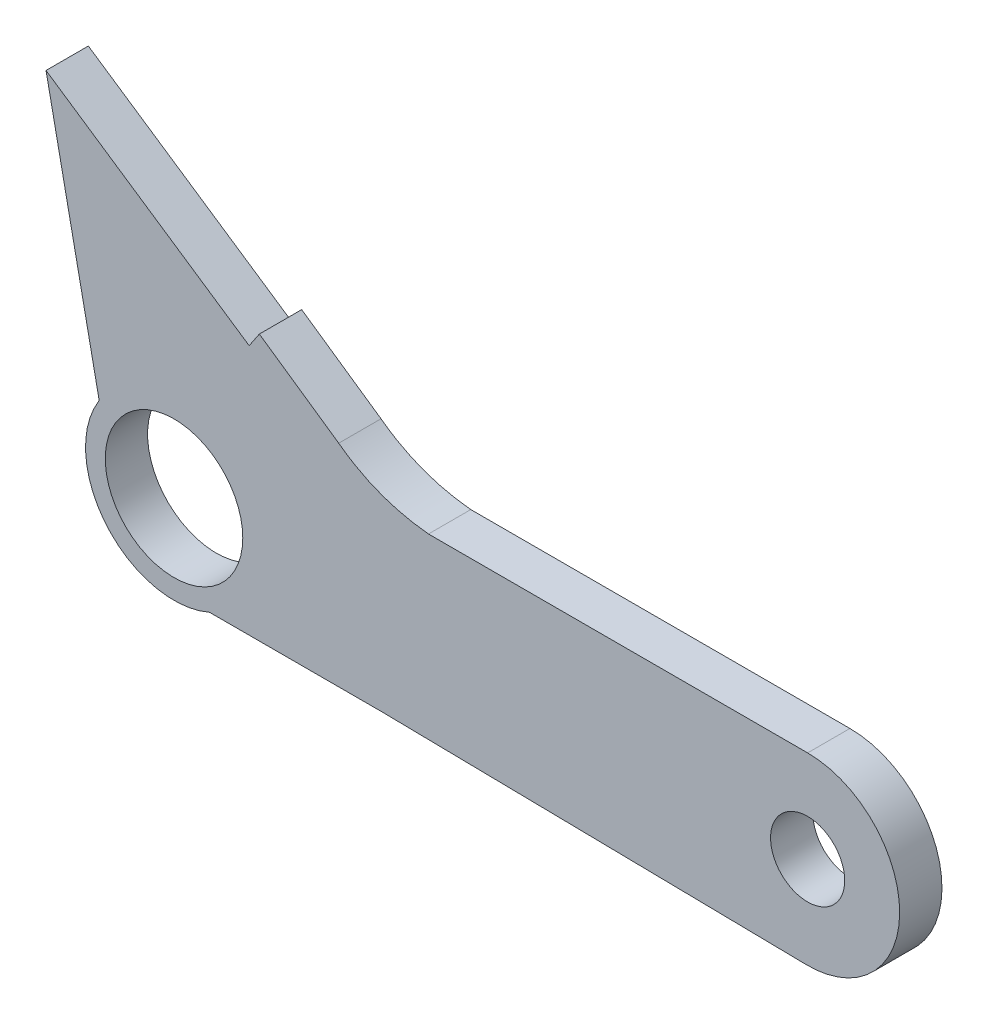
ISO-10303-21;
HEADER;
FILE_DESCRIPTION(('STEP AP214'),'2;1');
FILE_NAME('part.step','',(''),(''),'','','');
FILE_SCHEMA(('AUTOMOTIVE_DESIGN { 1 0 10303 214 1 1 1 1 }'));
ENDSEC;
DATA;
#1=APPLICATION_CONTEXT('core data for automotive mechanical design processes');
#2=APPLICATION_PROTOCOL_DEFINITION('international standard','automotive_design',2000,#1);
#3=PRODUCT_CONTEXT('',#1,'mechanical');
#4=PRODUCT('Part','Part','',(#3));
#5=PRODUCT_RELATED_PRODUCT_CATEGORY('part','',(#4));
#6=PRODUCT_DEFINITION_FORMATION('','',#4);
#7=PRODUCT_DEFINITION_CONTEXT('part definition',#1,'design');
#8=PRODUCT_DEFINITION('design','',#6,#7);
#9=PRODUCT_DEFINITION_SHAPE('','',#8);
#10=(LENGTH_UNIT() NAMED_UNIT(*) SI_UNIT(.MILLI.,.METRE.));
#11=(NAMED_UNIT(*) PLANE_ANGLE_UNIT() SI_UNIT($,.RADIAN.));
#12=(NAMED_UNIT(*) SI_UNIT($,.STERADIAN.) SOLID_ANGLE_UNIT());
#13=UNCERTAINTY_MEASURE_WITH_UNIT(LENGTH_MEASURE(1.E-05),#10,'distance_accuracy_value','');
#14=(GEOMETRIC_REPRESENTATION_CONTEXT(3) GLOBAL_UNCERTAINTY_ASSIGNED_CONTEXT((#13)) GLOBAL_UNIT_ASSIGNED_CONTEXT((#10,
#11,#12)) REPRESENTATION_CONTEXT('',''));
#15=CARTESIAN_POINT('',(0.,0.,0.));
#16=DIRECTION('',(0.,0.,1.));
#17=DIRECTION('',(1.,0.,0.));
#18=AXIS2_PLACEMENT_3D('',#15,#16,#17);
#19=CARTESIAN_POINT('',(-153.32908699017,31.6570272076157,3.80000000342412));
#20=DIRECTION('',(0.,0.,1.));
#21=DIRECTION('',(1.,0.,0.));
#22=AXIS2_PLACEMENT_3D('',#19,#20,#21);
#23=PLANE('',#22);
#24=CARTESIAN_POINT('',(-153.32908699017,31.6570272076157,3.80000000342412));
#25=DIRECTION('',(0.,0.,1.));
#26=DIRECTION('',(1.,0.,0.));
#27=AXIS2_PLACEMENT_3D('',#24,#25,#26);
#28=CIRCLE('',#27,4.90656360395826);
#29=CARTESIAN_POINT('',(-148.422523386211,31.6570272076157,3.80000000342412));
#30=VERTEX_POINT('',#29);
#31=EDGE_CURVE('E160',#30,#30,#28,.T.);
#32=ORIENTED_EDGE('',*,*,#31,.F.);
#33=EDGE_LOOP('',(#32));
#34=FACE_BOUND('',#33,.T.);
#35=CARTESIAN_POINT('',(-153.32908699017,31.6570272076157,3.80000000342412));
#36=DIRECTION('',(0.,0.,1.));
#37=DIRECTION('',(1.,0.,0.));
#38=AXIS2_PLACEMENT_3D('',#35,#36,#37);
#39=CIRCLE('',#38,12.1826586906075);
#40=CARTESIAN_POINT('',(-153.718100866553,19.4805810521968,3.80000000342412));
#41=VERTEX_POINT('',#40);
#42=CARTESIAN_POINT('',(-153.32908699017,43.8396858982233,3.80000000342412));
#43=VERTEX_POINT('',#42);
#44=EDGE_CURVE('E189',#41,#43,#39,.T.);
#45=ORIENTED_EDGE('',*,*,#44,.T.);
#46=DIRECTION('',(-1.,0.,0.));
#47=VECTOR('',#46,1.);
#48=CARTESIAN_POINT('',(-203.511333483619,43.8396858982233,3.80000000342412));
#49=LINE('',#48,#47);
#50=CARTESIAN_POINT('',(-203.511333483619,43.8396858982233,3.80000000342412));
#51=VERTEX_POINT('',#50);
#52=EDGE_CURVE('E108',#43,#51,#49,.T.);
#53=ORIENTED_EDGE('',*,*,#52,.T.);
#54=CARTESIAN_POINT('',(-203.511333483619,43.8396858982233,3.80000000342412));
#55=CARTESIAN_POINT('',(-208.172582178688,44.2976729303848,3.80000000342412));
#56=CARTESIAN_POINT('',(-212.097536786331,45.8384901922571,3.80000000342412));
#57=CARTESIAN_POINT('',(-215.391942553687,48.3061625787208,3.80000000342412));
#58=B_SPLINE_CURVE_WITH_KNOTS('',3,(#54,#55,#56,#57),.UNSPECIFIED.,.F.,.F.,(4,4),(0.24,0.28),.UNSPECIFIED.);
#59=CARTESIAN_POINT('',(-215.391942553687,48.3061625787208,3.80000000342412));
#60=VERTEX_POINT('',#59);
#61=EDGE_CURVE('E218',#51,#60,#58,.T.);
#62=ORIENTED_EDGE('',*,*,#61,.T.);
#63=DIRECTION('',(-0.822645279419272,0.568554961502569,0.));
#64=VECTOR('',#63,1.);
#65=CARTESIAN_POINT('',(-225.895010686111,55.5651497109446,3.80000000342412));
#66=LINE('',#65,#64);
#67=CARTESIAN_POINT('',(-225.895010686111,55.5651497109446,3.80000000342412));
#68=VERTEX_POINT('',#67);
#69=EDGE_CURVE('E238',#60,#68,#66,.T.);
#70=ORIENTED_EDGE('',*,*,#69,.T.);
#71=DIRECTION('',(-0.558654024014095,-0.829400796631435,0.));
#72=VECTOR('',#71,1.);
#73=CARTESIAN_POINT('',(-227.24597461826,53.5594529587881,3.80000000342412));
#74=LINE('',#73,#72);
#75=CARTESIAN_POINT('',(-227.24597461826,53.5594529587881,3.80000000342412));
#76=VERTEX_POINT('',#75);
#77=EDGE_CURVE('E234',#68,#76,#74,.T.);
#78=ORIENTED_EDGE('',*,*,#77,.T.);
#79=DIRECTION('',(-0.82942340172924,0.558620462088435,0.));
#80=VECTOR('',#79,1.);
#81=CARTESIAN_POINT('',(-254.12908699017,71.6653523393242,3.80000000342412));
#82=LINE('',#81,#80);
#83=CARTESIAN_POINT('',(-254.12908699017,71.6653523393242,3.80000000342412));
#84=VERTEX_POINT('',#83);
#85=EDGE_CURVE('E237',#76,#84,#82,.T.);
#86=ORIENTED_EDGE('',*,*,#85,.T.);
#87=DIRECTION('',(0.200817703010496,-0.979628628694358,0.));
#88=VECTOR('',#87,1.);
#89=CARTESIAN_POINT('',(-247.094072806183,37.3471563108404,3.80000000342412));
#90=LINE('',#89,#88);
#91=CARTESIAN_POINT('',(-247.094072806183,37.3471563108404,3.80000000342412));
#92=VERTEX_POINT('',#91);
#93=EDGE_CURVE('E133',#84,#92,#90,.T.);
#94=ORIENTED_EDGE('',*,*,#93,.T.);
#95=CARTESIAN_POINT('',(-237.18946647183,31.0987756420895,3.80000000342412));
#96=DIRECTION('',(0.,0.,1.));
#97=DIRECTION('',(1.,0.,0.));
#98=AXIS2_PLACEMENT_3D('',#95,#96,#97);
#99=CIRCLE('',#98,11.7108277939743);
#100=CARTESIAN_POINT('',(-232.489396699723,20.3725073367822,3.80000000342412));
#101=VERTEX_POINT('',#100);
#102=EDGE_CURVE('E127',#92,#101,#99,.T.);
#103=ORIENTED_EDGE('',*,*,#102,.T.);
#104=DIRECTION('',(1.,0.,0.));
#105=VECTOR('',#104,1.);
#106=CARTESIAN_POINT('',(-209.56836020208,20.3725073367822,3.80000000342412));
#107=LINE('',#106,#105);
#108=CARTESIAN_POINT('',(-209.56836020208,20.3725073367822,3.80000000342412));
#109=VERTEX_POINT('',#108);
#110=EDGE_CURVE('E131',#101,#109,#107,.T.);
#111=ORIENTED_EDGE('',*,*,#110,.T.);
#112=DIRECTION('',(0.999872504610725,-0.0159679217018297,0.));
#113=VECTOR('',#112,1.);
#114=CARTESIAN_POINT('',(-209.56836020208,20.3725073367822,3.80000000342412));
#115=LINE('',#114,#113);
#116=EDGE_CURVE('E59',#109,#41,#115,.T.);
#117=ORIENTED_EDGE('',*,*,#116,.T.);
#118=EDGE_LOOP('',(#45,#53,#62,#70,#78,#86,#94,#103,#111,#117));
#119=FACE_BOUND('',#118,.T.);
#120=CARTESIAN_POINT('',(-237.18946647183,31.0987756420895,3.80000000342412));
#121=DIRECTION('',(0.,0.,1.));
#122=DIRECTION('',(1.,0.,0.));
#123=AXIS2_PLACEMENT_3D('',#120,#121,#122);
#124=CIRCLE('',#123,9.10000000000002);
#125=CARTESIAN_POINT('',(-228.08946647183,31.0987756420895,3.80000000342412));
#126=VERTEX_POINT('',#125);
#127=EDGE_CURVE('E381',#126,#126,#124,.T.);
#128=ORIENTED_EDGE('',*,*,#127,.F.);
#129=EDGE_LOOP('',(#128));
#130=FACE_BOUND('',#129,.T.);
#131=ADVANCED_FACE('F41',(#34,#119,#130),#23,.T.);
#132=CARTESIAN_POINT('',(-153.32908699017,31.6570272076157,-1.79999999657588));
#133=DIRECTION('',(0.,0.,1.));
#134=DIRECTION('',(1.,0.,0.));
#135=AXIS2_PLACEMENT_3D('',#132,#133,#134);
#136=PLANE('',#135);
#137=CARTESIAN_POINT('',(-153.32908699017,31.6570272076157,-1.79999999657588));
#138=DIRECTION('',(0.,0.,1.));
#139=DIRECTION('',(1.,0.,0.));
#140=AXIS2_PLACEMENT_3D('',#137,#138,#139);
#141=CIRCLE('',#140,12.1826586906075);
#142=CARTESIAN_POINT('',(-153.718100866553,19.4805810521968,-1.79999999657588));
#143=VERTEX_POINT('',#142);
#144=CARTESIAN_POINT('',(-153.32908699017,43.8396858982233,-1.79999999657588));
#145=VERTEX_POINT('',#144);
#146=EDGE_CURVE('E155',#143,#145,#141,.T.);
#147=ORIENTED_EDGE('',*,*,#146,.F.);
#148=DIRECTION('',(0.999872504610725,-0.0159679217018297,0.));
#149=VECTOR('',#148,1.);
#150=CARTESIAN_POINT('',(-209.56836020208,20.3725073367822,-1.79999999657588));
#151=LINE('',#150,#149);
#152=CARTESIAN_POINT('',(-209.56836020208,20.3725073367822,-1.79999999657588));
#153=VERTEX_POINT('',#152);
#154=EDGE_CURVE('E100',#153,#143,#151,.T.);
#155=ORIENTED_EDGE('',*,*,#154,.F.);
#156=DIRECTION('',(1.,0.,0.));
#157=VECTOR('',#156,1.);
#158=CARTESIAN_POINT('',(-209.56836020208,20.3725073367822,-1.79999999657588));
#159=LINE('',#158,#157);
#160=CARTESIAN_POINT('',(-232.489396699723,20.3725073367822,-1.79999999657588));
#161=VERTEX_POINT('',#160);
#162=EDGE_CURVE('E94',#161,#153,#159,.T.);
#163=ORIENTED_EDGE('',*,*,#162,.F.);
#164=CARTESIAN_POINT('',(-237.18946647183,31.0987756420895,-1.79999999657588));
#165=DIRECTION('',(0.,0.,1.));
#166=DIRECTION('',(1.,0.,0.));
#167=AXIS2_PLACEMENT_3D('',#164,#165,#166);
#168=CIRCLE('',#167,11.7108277939743);
#169=CARTESIAN_POINT('',(-247.094072806183,37.3471563108404,-1.79999999657588));
#170=VERTEX_POINT('',#169);
#171=EDGE_CURVE('E142',#170,#161,#168,.T.);
#172=ORIENTED_EDGE('',*,*,#171,.F.);
#173=DIRECTION('',(0.200817703010496,-0.979628628694358,0.));
#174=VECTOR('',#173,1.);
#175=CARTESIAN_POINT('',(-247.094072806183,37.3471563108404,-1.79999999657588));
#176=LINE('',#175,#174);
#177=CARTESIAN_POINT('',(-254.12908699017,71.6653523393242,-1.79999999657588));
#178=VERTEX_POINT('',#177);
#179=EDGE_CURVE('E180',#178,#170,#176,.T.);
#180=ORIENTED_EDGE('',*,*,#179,.F.);
#181=DIRECTION('',(-0.82942340172924,0.558620462088435,0.));
#182=VECTOR('',#181,1.);
#183=CARTESIAN_POINT('',(-254.12908699017,71.6653523393242,-1.79999999657588));
#184=LINE('',#183,#182);
#185=CARTESIAN_POINT('',(-227.24597461826,53.5594529587881,-1.79999999657588));
#186=VERTEX_POINT('',#185);
#187=EDGE_CURVE('E177',#186,#178,#184,.T.);
#188=ORIENTED_EDGE('',*,*,#187,.F.);
#189=DIRECTION('',(-0.558654024014095,-0.829400796631435,0.));
#190=VECTOR('',#189,1.);
#191=CARTESIAN_POINT('',(-227.24597461826,53.5594529587881,-1.79999999657588));
#192=LINE('',#191,#190);
#193=CARTESIAN_POINT('',(-225.895010686111,55.5651497109446,-1.79999999657588));
#194=VERTEX_POINT('',#193);
#195=EDGE_CURVE('E174',#194,#186,#192,.T.);
#196=ORIENTED_EDGE('',*,*,#195,.F.);
#197=DIRECTION('',(-0.822645279419272,0.568554961502569,0.));
#198=VECTOR('',#197,1.);
#199=CARTESIAN_POINT('',(-225.895010686111,55.5651497109446,-1.79999999657588));
#200=LINE('',#199,#198);
#201=CARTESIAN_POINT('',(-215.391942553687,48.3061625787208,-1.79999999657588));
#202=VERTEX_POINT('',#201);
#203=EDGE_CURVE('E168',#202,#194,#200,.T.);
#204=ORIENTED_EDGE('',*,*,#203,.F.);
#205=CARTESIAN_POINT('',(-203.511333483619,43.8396858982233,-1.79999999657588));
#206=CARTESIAN_POINT('',(-208.172582178688,44.2976729303848,-1.79999999657588));
#207=CARTESIAN_POINT('',(-212.097536786331,45.8384901922571,-1.79999999657588));
#208=CARTESIAN_POINT('',(-215.391942553687,48.3061625787208,-1.79999999657588));
#209=B_SPLINE_CURVE_WITH_KNOTS('',3,(#205,#206,#207,#208),.UNSPECIFIED.,.F.,.F.,(4,4),(0.24,
0.28),.UNSPECIFIED.);
#210=CARTESIAN_POINT('',(-203.511333483619,43.8396858982233,-1.79999999657588));
#211=VERTEX_POINT('',#210);
#212=EDGE_CURVE('E163',#211,#202,#209,.T.);
#213=ORIENTED_EDGE('',*,*,#212,.F.);
#214=DIRECTION('',(-1.,0.,0.));
#215=VECTOR('',#214,1.);
#216=CARTESIAN_POINT('',(-203.511333483619,43.8396858982233,-1.79999999657588));
#217=LINE('',#216,#215);
#218=EDGE_CURVE('E159',#145,#211,#217,.T.);
#219=ORIENTED_EDGE('',*,*,#218,.F.);
#220=EDGE_LOOP('',(#147,#155,#163,#172,#180,#188,#196,#204,#213,#219));
#221=FACE_BOUND('',#220,.T.);
#222=CARTESIAN_POINT('',(-153.32908699017,31.6570272076157,-1.79999999657588));
#223=DIRECTION('',(0.,0.,1.));
#224=DIRECTION('',(1.,0.,0.));
#225=AXIS2_PLACEMENT_3D('',#222,#223,#224);
#226=CIRCLE('',#225,4.90656360395826);
#227=CARTESIAN_POINT('',(-148.422523386211,31.6570272076157,-1.79999999657588));
#228=VERTEX_POINT('',#227);
#229=EDGE_CURVE('E389',#228,#228,#226,.T.);
#230=ORIENTED_EDGE('',*,*,#229,.T.);
#231=EDGE_LOOP('',(#230));
#232=FACE_BOUND('',#231,.T.);
#233=CARTESIAN_POINT('',(-237.18946647183,31.0987756420895,-1.79999999657588));
#234=DIRECTION('',(0.,0.,1.));
#235=DIRECTION('',(1.,0.,0.));
#236=AXIS2_PLACEMENT_3D('',#233,#234,#235);
#237=CIRCLE('',#236,9.10000000000002);
#238=CARTESIAN_POINT('',(-228.08946647183,31.0987756420895,-1.79999999657588));
#239=VERTEX_POINT('',#238);
#240=EDGE_CURVE('E384',#239,#239,#237,.T.);
#241=ORIENTED_EDGE('',*,*,#240,.T.);
#242=EDGE_LOOP('',(#241));
#243=FACE_BOUND('',#242,.T.);
#244=ADVANCED_FACE('F222',(#221,#232,#243),#136,.F.);
#245=CARTESIAN_POINT('',(-153.32908699017,31.6570272076157,3.80000000342412));
#246=DIRECTION('',(0.,0.,-1.));
#247=DIRECTION('',(-1.,0.,0.));
#248=AXIS2_PLACEMENT_3D('',#245,#246,#247);
#249=CYLINDRICAL_SURFACE('',#248,12.1826586906075);
#250=ORIENTED_EDGE('',*,*,#146,.T.);
#251=DIRECTION('',(0.,0.,-1.));
#252=VECTOR('',#251,1.);
#253=CARTESIAN_POINT('',(-153.32908699017,43.8396858982233,3.80000000342412));
#254=LINE('',#253,#252);
#255=EDGE_CURVE('E11',#43,#145,#254,.T.);
#256=ORIENTED_EDGE('',*,*,#255,.F.);
#257=ORIENTED_EDGE('',*,*,#44,.F.);
#258=DIRECTION('',(0.,0.,-1.));
#259=VECTOR('',#258,1.);
#260=CARTESIAN_POINT('',(-153.718100866553,19.4805810521968,3.80000000342412));
#261=LINE('',#260,#259);
#262=EDGE_CURVE('E151',#41,#143,#261,.T.);
#263=ORIENTED_EDGE('',*,*,#262,.T.);
#264=EDGE_LOOP('',(#250,#256,#257,#263));
#265=FACE_BOUND('',#264,.T.);
#266=ADVANCED_FACE('F43',(#265),#249,.T.);
#267=CARTESIAN_POINT('',(-203.511333483619,43.8396858982233,3.80000000342412));
#268=DIRECTION('',(0.,-1.,0.));
#269=DIRECTION('',(1.,0.,0.));
#270=AXIS2_PLACEMENT_3D('',#267,#268,#269);
#271=PLANE('',#270);
#272=ORIENTED_EDGE('',*,*,#218,.T.);
#273=DIRECTION('',(0.,0.,-1.));
#274=VECTOR('',#273,1.);
#275=CARTESIAN_POINT('',(-203.511333483619,43.8396858982233,3.80000000342412));
#276=LINE('',#275,#274);
#277=EDGE_CURVE('E51',#51,#211,#276,.T.);
#278=ORIENTED_EDGE('',*,*,#277,.F.);
#279=ORIENTED_EDGE('',*,*,#52,.F.);
#280=ORIENTED_EDGE('',*,*,#255,.T.);
#281=EDGE_LOOP('',(#272,#278,#279,#280));
#282=FACE_BOUND('',#281,.T.);
#283=ADVANCED_FACE('F258',(#282),#271,.F.);
#284=DIRECTION('',(0.,0.,-1.));
#285=VECTOR('',#284,1.);
#286=SURFACE_OF_LINEAR_EXTRUSION('',#58,#285);
#287=ORIENTED_EDGE('',*,*,#212,.T.);
#288=DIRECTION('',(0.,0.,-1.));
#289=VECTOR('',#288,1.);
#290=CARTESIAN_POINT('',(-215.391942553687,48.3061625787208,3.80000000342412));
#291=LINE('',#290,#289);
#292=EDGE_CURVE('E208',#60,#202,#291,.T.);
#293=ORIENTED_EDGE('',*,*,#292,.F.);
#294=ORIENTED_EDGE('',*,*,#61,.F.);
#295=ORIENTED_EDGE('',*,*,#277,.T.);
#296=EDGE_LOOP('',(#287,#293,#294,#295));
#297=FACE_BOUND('',#296,.T.);
#298=ADVANCED_FACE('F216',(#297),#286,.F.);
#299=CARTESIAN_POINT('',(-225.895010686111,55.5651497109446,3.80000000342412));
#300=DIRECTION('',(-0.568554961502569,-0.822645279419272,0.));
#301=DIRECTION('',(0.822645279419272,-0.568554961502569,0.));
#302=AXIS2_PLACEMENT_3D('',#299,#300,#301);
#303=PLANE('',#302);
#304=ORIENTED_EDGE('',*,*,#203,.T.);
#305=DIRECTION('',(0.,0.,-1.));
#306=VECTOR('',#305,1.);
#307=CARTESIAN_POINT('',(-225.895010686111,55.5651497109446,3.80000000342412));
#308=LINE('',#307,#306);
#309=EDGE_CURVE('E204',#68,#194,#308,.T.);
#310=ORIENTED_EDGE('',*,*,#309,.F.);
#311=ORIENTED_EDGE('',*,*,#69,.F.);
#312=ORIENTED_EDGE('',*,*,#292,.T.);
#313=EDGE_LOOP('',(#304,#310,#311,#312));
#314=FACE_BOUND('',#313,.T.);
#315=ADVANCED_FACE('F228',(#314),#303,.F.);
#316=CARTESIAN_POINT('',(-227.24597461826,53.5594529587881,3.80000000342412));
#317=DIRECTION('',(0.829400796631435,-0.558654024014095,0.));
#318=DIRECTION('',(0.558654024014095,0.829400796631435,0.));
#319=AXIS2_PLACEMENT_3D('',#316,#317,#318);
#320=PLANE('',#319);
#321=ORIENTED_EDGE('',*,*,#195,.T.);
#322=DIRECTION('',(0.,0.,-1.));
#323=VECTOR('',#322,1.);
#324=CARTESIAN_POINT('',(-227.24597461826,53.5594529587881,3.80000000342412));
#325=LINE('',#324,#323);
#326=EDGE_CURVE('E200',#76,#186,#325,.T.);
#327=ORIENTED_EDGE('',*,*,#326,.F.);
#328=ORIENTED_EDGE('',*,*,#77,.F.);
#329=ORIENTED_EDGE('',*,*,#309,.T.);
#330=EDGE_LOOP('',(#321,#327,#328,#329));
#331=FACE_BOUND('',#330,.T.);
#332=ADVANCED_FACE('F232',(#331),#320,.F.);
#333=CARTESIAN_POINT('',(-254.12908699017,71.6653523393242,3.80000000342412));
#334=DIRECTION('',(-0.558620462088435,-0.82942340172924,0.));
#335=DIRECTION('',(0.82942340172924,-0.558620462088435,0.));
#336=AXIS2_PLACEMENT_3D('',#333,#334,#335);
#337=PLANE('',#336);
#338=ORIENTED_EDGE('',*,*,#187,.T.);
#339=DIRECTION('',(0.,0.,-1.));
#340=VECTOR('',#339,1.);
#341=CARTESIAN_POINT('',(-254.12908699017,71.6653523393242,3.80000000342412));
#342=LINE('',#341,#340);
#343=EDGE_CURVE('E196',#84,#178,#342,.T.);
#344=ORIENTED_EDGE('',*,*,#343,.F.);
#345=ORIENTED_EDGE('',*,*,#85,.F.);
#346=ORIENTED_EDGE('',*,*,#326,.T.);
#347=EDGE_LOOP('',(#338,#344,#345,#346));
#348=FACE_BOUND('',#347,.T.);
#349=ADVANCED_FACE('F287',(#348),#337,.F.);
#350=CARTESIAN_POINT('',(-247.094072806183,37.3471563108404,3.80000000342412));
#351=DIRECTION('',(0.979628628694358,0.200817703010497,0.));
#352=DIRECTION('',(-0.200817703010497,0.979628628694358,0.));
#353=AXIS2_PLACEMENT_3D('',#350,#351,#352);
#354=PLANE('',#353);
#355=ORIENTED_EDGE('',*,*,#179,.T.);
#356=DIRECTION('',(0.,0.,-1.));
#357=VECTOR('',#356,1.);
#358=CARTESIAN_POINT('',(-247.094072806183,37.3471563108404,3.80000000342412));
#359=LINE('',#358,#357);
#360=EDGE_CURVE('E144',#92,#170,#359,.T.);
#361=ORIENTED_EDGE('',*,*,#360,.F.);
#362=ORIENTED_EDGE('',*,*,#93,.F.);
#363=ORIENTED_EDGE('',*,*,#343,.T.);
#364=EDGE_LOOP('',(#355,#361,#362,#363));
#365=FACE_BOUND('',#364,.T.);
#366=ADVANCED_FACE('F284',(#365),#354,.F.);
#367=CARTESIAN_POINT('',(-237.18946647183,31.0987756420895,3.80000000342412));
#368=DIRECTION('',(0.,0.,-1.));
#369=DIRECTION('',(-1.,0.,0.));
#370=AXIS2_PLACEMENT_3D('',#367,#368,#369);
#371=CYLINDRICAL_SURFACE('',#370,11.7108277939743);
#372=ORIENTED_EDGE('',*,*,#171,.T.);
#373=DIRECTION('',(0.,0.,-1.));
#374=VECTOR('',#373,1.);
#375=CARTESIAN_POINT('',(-232.489396699723,20.3725073367822,3.80000000342412));
#376=LINE('',#375,#374);
#377=EDGE_CURVE('E139',#101,#161,#376,.T.);
#378=ORIENTED_EDGE('',*,*,#377,.F.);
#379=ORIENTED_EDGE('',*,*,#102,.F.);
#380=ORIENTED_EDGE('',*,*,#360,.T.);
#381=EDGE_LOOP('',(#372,#378,#379,#380));
#382=FACE_BOUND('',#381,.T.);
#383=ADVANCED_FACE('F140',(#382),#371,.T.);
#384=CARTESIAN_POINT('',(-209.56836020208,20.3725073367822,3.80000000342412));
#385=DIRECTION('',(0.,1.,0.));
#386=DIRECTION('',(0.,0.,1.));
#387=AXIS2_PLACEMENT_3D('',#384,#385,#386);
#388=PLANE('',#387);
#389=ORIENTED_EDGE('',*,*,#162,.T.);
#390=DIRECTION('',(0.,0.,-1.));
#391=VECTOR('',#390,1.);
#392=CARTESIAN_POINT('',(-209.56836020208,20.3725073367822,3.80000000342412));
#393=LINE('',#392,#391);
#394=EDGE_CURVE('E145',#109,#153,#393,.T.);
#395=ORIENTED_EDGE('',*,*,#394,.F.);
#396=ORIENTED_EDGE('',*,*,#110,.F.);
#397=ORIENTED_EDGE('',*,*,#377,.T.);
#398=EDGE_LOOP('',(#389,#395,#396,#397));
#399=FACE_BOUND('',#398,.T.);
#400=ADVANCED_FACE('F147',(#399),#388,.F.);
#401=CARTESIAN_POINT('',(-209.56836020208,20.3725073367822,3.80000000342412));
#402=DIRECTION('',(0.0159679217018297,0.999872504610725,0.));
#403=DIRECTION('',(-0.999872504610725,0.0159679217018297,0.));
#404=AXIS2_PLACEMENT_3D('',#401,#402,#403);
#405=PLANE('',#404);
#406=ORIENTED_EDGE('',*,*,#154,.T.);
#407=ORIENTED_EDGE('',*,*,#262,.F.);
#408=ORIENTED_EDGE('',*,*,#116,.F.);
#409=ORIENTED_EDGE('',*,*,#394,.T.);
#410=EDGE_LOOP('',(#406,#407,#408,#409));
#411=FACE_BOUND('',#410,.T.);
#412=ADVANCED_FACE('F277',(#411),#405,.F.);
#413=CARTESIAN_POINT('',(-153.32908699017,31.6570272076157,3.80000000342412));
#414=DIRECTION('',(0.,0.,-1.));
#415=DIRECTION('',(-1.,0.,0.));
#416=AXIS2_PLACEMENT_3D('',#413,#414,#415);
#417=CYLINDRICAL_SURFACE('',#416,4.90656360395826);
#418=ORIENTED_EDGE('',*,*,#31,.T.);
#419=EDGE_LOOP('',(#418));
#420=FACE_BOUND('',#419,.T.);
#421=ORIENTED_EDGE('',*,*,#229,.F.);
#422=EDGE_LOOP('',(#421));
#423=FACE_BOUND('',#422,.T.);
#424=ADVANCED_FACE('F274',(#420,#423),#417,.F.);
#425=CARTESIAN_POINT('',(-237.18946647183,31.0987756420895,3.80000000342412));
#426=DIRECTION('',(0.,0.,-1.));
#427=DIRECTION('',(-1.,0.,0.));
#428=AXIS2_PLACEMENT_3D('',#425,#426,#427);
#429=CYLINDRICAL_SURFACE('',#428,9.10000000000002);
#430=ORIENTED_EDGE('',*,*,#127,.T.);
#431=EDGE_LOOP('',(#430));
#432=FACE_BOUND('',#431,.T.);
#433=ORIENTED_EDGE('',*,*,#240,.F.);
#434=EDGE_LOOP('',(#433));
#435=FACE_BOUND('',#434,.T.);
#436=ADVANCED_FACE('F362',(#432,#435),#429,.F.);
#437=CLOSED_SHELL('',(#131,#244,#266,#283,#298,#315,#332,#349,#366,#383,#400,#412,#424,#436));
#438=MANIFOLD_SOLID_BREP('B2',#437);
#439=ADVANCED_BREP_SHAPE_REPRESENTATION('',(#18,#438),#14);
#440=SHAPE_DEFINITION_REPRESENTATION(#9,#439);
ENDSEC;
END-ISO-10303-21;
